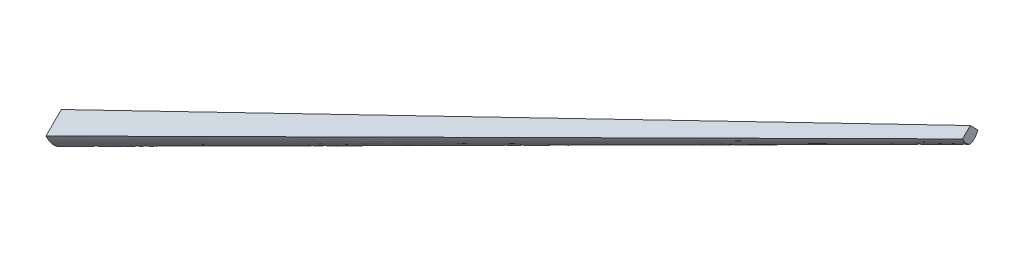
ISO-10303-21;
HEADER;
FILE_DESCRIPTION(('STEP AP214'),'2;1');
FILE_NAME('part.step','',(''),(''),'','','');
FILE_SCHEMA(('AUTOMOTIVE_DESIGN { 1 0 10303 214 1 1 1 1 }'));
ENDSEC;
DATA;
#1=APPLICATION_CONTEXT('core data for automotive mechanical design processes');
#2=APPLICATION_PROTOCOL_DEFINITION('international standard','automotive_design',2000,#1);
#3=PRODUCT_CONTEXT('',#1,'mechanical');
#4=PRODUCT('Part','Part','',(#3));
#5=PRODUCT_RELATED_PRODUCT_CATEGORY('part','',(#4));
#6=PRODUCT_DEFINITION_FORMATION('','',#4);
#7=PRODUCT_DEFINITION_CONTEXT('part definition',#1,'design');
#8=PRODUCT_DEFINITION('design','',#6,#7);
#9=PRODUCT_DEFINITION_SHAPE('','',#8);
#10=(LENGTH_UNIT() NAMED_UNIT(*) SI_UNIT(.MILLI.,.METRE.));
#11=(NAMED_UNIT(*) PLANE_ANGLE_UNIT() SI_UNIT($,.RADIAN.));
#12=(NAMED_UNIT(*) SI_UNIT($,.STERADIAN.) SOLID_ANGLE_UNIT());
#13=UNCERTAINTY_MEASURE_WITH_UNIT(LENGTH_MEASURE(1.E-05),#10,'distance_accuracy_value','');
#14=(GEOMETRIC_REPRESENTATION_CONTEXT(3) GLOBAL_UNCERTAINTY_ASSIGNED_CONTEXT((#13)) GLOBAL_UNIT_ASSIGNED_CONTEXT((#10,
#11,#12)) REPRESENTATION_CONTEXT('',''));
#15=CARTESIAN_POINT('',(0.,0.,0.));
#16=DIRECTION('',(0.,0.,1.));
#17=DIRECTION('',(1.,0.,0.));
#18=AXIS2_PLACEMENT_3D('',#15,#16,#17);
#19=CARTESIAN_POINT('',(57.,114.4,0.));
#20=CARTESIAN_POINT('',(0.,114.4,0.));
#21=CARTESIAN_POINT('',(57.,114.4,-0.00182095810749763));
#22=CARTESIAN_POINT('',(0.,114.4,-0.00364191621499526));
#23=CARTESIAN_POINT('',(57.,114.352907672617,-0.00546220916385912));
#24=CARTESIAN_POINT('',(0.,114.305815345234,-0.0109244183277182));
#25=CARTESIAN_POINT('',(57.,114.32002966172,-0.0109070616915182));
#26=CARTESIAN_POINT('',(0.,114.240059323441,-0.0218141233830365));
#27=CARTESIAN_POINT('',(57.,114.249222738711,-0.0198785714299646));
#28=CARTESIAN_POINT('',(0.,114.098445477423,-0.0397571428599293));
#29=CARTESIAN_POINT('',(57.,114.156548337744,-0.032132456041945));
#30=CARTESIAN_POINT('',(0.,113.913096675488,-0.0642649120838899));
#31=CARTESIAN_POINT('',(57.,114.034213823481,-0.0474417351200506));
#32=CARTESIAN_POINT('',(0.,113.668427646962,-0.0948834702401012));
#33=CARTESIAN_POINT('',(57.,113.886541749933,-0.0656072474393022));
#34=CARTESIAN_POINT('',(0.,113.373083499866,-0.131214494878604));
#35=CARTESIAN_POINT('',(57.,113.370012426993,-0.127548617429597));
#36=CARTESIAN_POINT('',(0.,112.340024853985,-0.255097234859193));
#37=CARTESIAN_POINT('',(57.,112.137163028017,-0.259027461460315));
#38=CARTESIAN_POINT('',(0.,109.874326056035,-0.51805492292063));
#39=CARTESIAN_POINT('',(57.,110.501004902275,-0.411740073326686));
#40=CARTESIAN_POINT('',(0.,106.60200980455,-0.823480146653373));
#41=CARTESIAN_POINT('',(57.,108.197187000479,-0.60964155845022));
#42=CARTESIAN_POINT('',(0.,101.994374000957,-1.21928311690044));
#43=CARTESIAN_POINT('',(57.,105.44956023543,-0.82314706743673));
#44=CARTESIAN_POINT('',(0.,96.4991204708607,-1.64629413487346));
#45=CARTESIAN_POINT('',(57.,101.925918142368,-1.05329602538316));
#46=CARTESIAN_POINT('',(0.,89.4518362847364,-2.10659205076633));
#47=CARTESIAN_POINT('',(57.0000000000001,98.2774944583724,-1.22854383866665));
#48=CARTESIAN_POINT('',(0.,82.1549889167448,-2.45708767733329));
#49=CARTESIAN_POINT('',(57.,95.5458702597783,-1.29200246249632));
#50=CARTESIAN_POINT('',(0.,76.6917405195566,-2.58400492499264));
#51=CARTESIAN_POINT('',(57.,93.7843198333664,-1.28990739427786));
#52=CARTESIAN_POINT('',(0.,73.1686396667328,-2.57981478855572));
#53=CARTESIAN_POINT('',(57.,92.7064529548784,-1.27556105945408));
#54=CARTESIAN_POINT('',(0.,71.0129059097568,-2.55112211890817));
#55=CARTESIAN_POINT('',(57.,91.4434168803456,-1.23757411909588));
#56=CARTESIAN_POINT('',(0.,68.4868337606911,-2.47514823819176));
#57=CARTESIAN_POINT('',(57.,89.8610871222189,-1.14403607707087));
#58=CARTESIAN_POINT('',(0.,65.3221742444376,-2.28807215414174));
#59=CARTESIAN_POINT('',(56.9999999999999,88.6339594379661,-1.01587816182833));
#60=CARTESIAN_POINT('',(0.,62.8679188759322,-2.03175632365666));
#61=CARTESIAN_POINT('',(57.,87.7322213407688,-0.870007471666012));
#62=CARTESIAN_POINT('',(0.,61.0644426815377,-1.74001494333202));
#63=CARTESIAN_POINT('',(57.,87.291174629283,-0.784346378199465));
#64=CARTESIAN_POINT('',(0.,60.1823492585658,-1.56869275639893));
#65=CARTESIAN_POINT('',(57.,86.9042703456185,-0.693141039222563));
#66=CARTESIAN_POINT('',(0.,59.4085406912369,-1.38628207844513));
#67=CARTESIAN_POINT('',(57.,86.5733208454091,-0.59333455424871));
#68=CARTESIAN_POINT('',(0.,58.746641690818,-1.18666910849742));
#69=CARTESIAN_POINT('',(57.,86.2785415535032,-0.4748173297146));
#70=CARTESIAN_POINT('',(0.,58.1570831070064,-0.9496346594292));
#71=CARTESIAN_POINT('',(57.,86.0648861911922,-0.349405025256917));
#72=CARTESIAN_POINT('',(0.,57.7297723823844,-0.698810050513834));
#73=CARTESIAN_POINT('',(57.,85.9154971726472,-0.217553009946631));
#74=CARTESIAN_POINT('',(0.,57.4309943452943,-0.435106019893263));
#75=CARTESIAN_POINT('',(57.,85.8398706402099,-0.125468872465283));
#76=CARTESIAN_POINT('',(0.,57.2797412804197,-0.250937744930566));
#77=CARTESIAN_POINT('',(57.,85.8046969145248,-0.0466468105661051));
#78=CARTESIAN_POINT('',(0.,57.2093938290495,-0.0932936211322103));
#79=CARTESIAN_POINT('',(57.,85.7984647875065,0.));
#80=CARTESIAN_POINT('',(0.,57.196929575013,0.));
#81=CARTESIAN_POINT('',(57.,85.8046969145248,0.0466468105660989));
#82=CARTESIAN_POINT('',(0.,57.2093938290495,0.0932936211321978));
#83=CARTESIAN_POINT('',(57.,85.8398706402099,0.125468872465298));
#84=CARTESIAN_POINT('',(0.,57.2797412804197,0.250937744930596));
#85=CARTESIAN_POINT('',(57.,85.9154971726472,0.217553009946615));
#86=CARTESIAN_POINT('',(0.,57.4309943452942,0.43510601989323));
#87=CARTESIAN_POINT('',(57.,86.0648861911922,0.349405025256929));
#88=CARTESIAN_POINT('',(0.,57.7297723823844,0.698810050513857));
#89=CARTESIAN_POINT('',(57.,86.2785415535032,0.474817329714599));
#90=CARTESIAN_POINT('',(0.,58.1570831070064,0.949634659429199));
#91=CARTESIAN_POINT('',(57.,86.5733208454091,0.593334554248706));
#92=CARTESIAN_POINT('',(0.,58.746641690818,1.18666910849741));
#93=CARTESIAN_POINT('',(57.,86.9042703456185,0.693141039222563));
#94=CARTESIAN_POINT('',(0.,59.4085406912369,1.38628207844513));
#95=CARTESIAN_POINT('',(57.,87.2911746292829,0.784346378199468));
#96=CARTESIAN_POINT('',(0.,60.1823492585659,1.56869275639894));
#97=CARTESIAN_POINT('',(57.,87.7322213407688,0.870007471666016));
#98=CARTESIAN_POINT('',(0.,61.0644426815377,1.74001494333203));
#99=CARTESIAN_POINT('',(57.,88.6339594379661,1.01587816182832));
#100=CARTESIAN_POINT('',(0.,62.867918875932,2.03175632365664));
#101=CARTESIAN_POINT('',(57.,89.8610871222189,1.14403607707087));
#102=CARTESIAN_POINT('',(0.,65.3221742444377,2.28807215414174));
#103=CARTESIAN_POINT('',(57.,91.4434168803456,1.23757411909588));
#104=CARTESIAN_POINT('',(0.,68.4868337606911,2.47514823819176));
#105=CARTESIAN_POINT('',(57.,92.7064529548784,1.27556105945408));
#106=CARTESIAN_POINT('',(0.,71.0129059097568,2.55112211890816));
#107=CARTESIAN_POINT('',(57.,93.7843198333664,1.28990739427786));
#108=CARTESIAN_POINT('',(0.,73.1686396667329,2.57981478855573));
#109=CARTESIAN_POINT('',(57.,95.5458702597782,1.29200246249631));
#110=CARTESIAN_POINT('',(0.,76.6917405195565,2.58400492499263));
#111=CARTESIAN_POINT('',(57.,98.2774944583724,1.22854383866664));
#112=CARTESIAN_POINT('',(0.,82.1549889167447,2.45708767733329));
#113=CARTESIAN_POINT('',(57.,101.925918142368,1.05329602538317));
#114=CARTESIAN_POINT('',(0.,89.4518362847363,2.10659205076633));
#115=CARTESIAN_POINT('',(57.,105.44956023543,0.823147067436728));
#116=CARTESIAN_POINT('',(0.,96.4991204708606,1.64629413487346));
#117=CARTESIAN_POINT('',(57.,108.197187000479,0.609641558450223));
#118=CARTESIAN_POINT('',(0.,101.994374000957,1.21928311690045));
#119=CARTESIAN_POINT('',(57.,110.501004902275,0.411740073326685));
#120=CARTESIAN_POINT('',(0.,106.60200980455,0.823480146653369));
#121=CARTESIAN_POINT('',(57.,112.137163028017,0.259027461460316));
#122=CARTESIAN_POINT('',(0.,109.874326056034,0.518054922920633));
#123=CARTESIAN_POINT('',(57.,113.370012426993,0.127548617429595));
#124=CARTESIAN_POINT('',(0.,112.340024853985,0.25509723485919));
#125=CARTESIAN_POINT('',(57.,113.886541749933,0.0656072474393026));
#126=CARTESIAN_POINT('',(0.,113.373083499866,0.131214494878605));
#127=CARTESIAN_POINT('',(57.,114.034213823481,0.0474417351200502));
#128=CARTESIAN_POINT('',(0.,113.668427646962,0.0948834702401005));
#129=CARTESIAN_POINT('',(57.,114.156548337744,0.0321324560419456));
#130=CARTESIAN_POINT('',(0.,113.913096675488,0.0642649120838911));
#131=CARTESIAN_POINT('',(57.,114.249222738711,0.0198785714299638));
#132=CARTESIAN_POINT('',(0.,114.098445477423,0.0397571428599277));
#133=CARTESIAN_POINT('',(57.,114.32002966172,0.0109070616915188));
#134=CARTESIAN_POINT('',(0.,114.240059323441,0.0218141233830376));
#135=CARTESIAN_POINT('',(57.,114.352907672617,0.00546220916385825));
#136=CARTESIAN_POINT('',(0.,114.305815345234,0.0109244183277165));
#137=CARTESIAN_POINT('',(57.,114.4,0.00182095810749828));
#138=CARTESIAN_POINT('',(0.,114.4,0.00364191621499655));
#139=CARTESIAN_POINT('',(57.,114.4,0.));
#140=CARTESIAN_POINT('',(0.,114.4,0.));
#141=B_SPLINE_SURFACE_WITH_KNOTS('',3,1,((#19,#20),(#21,#22),(#23,#24),(#25,#26),(#27,#28),(#29,
#30),(#31,#32),(#33,#34),(#35,#36),(#37,#38),(#39,#40),(#41,#42),(#43,#44),(#45,#46),(#47,#48),
(#49,#50),(#51,#52),(#53,#54),(#55,#56),(#57,#58),(#59,#60),(#61,#62),(#63,#64),(#65,#66),(#67,
#68),(#69,#70),(#71,#72),(#73,#74),(#75,#76),(#77,#78),(#79,#80),(#81,#82),(#83,#84),(#85,#86),
(#87,#88),(#89,#90),(#91,#92),(#93,#94),(#95,#96),(#97,#98),(#99,#100),(#101,#102),(#103,#104),
(#105,#106),(#107,#108),(#109,#110),(#111,#112),(#113,#114),(#115,#116),(#117,#118),(#119,#120),
(#121,#122),(#123,#124),(#125,#126),(#127,#128),(#129,#130),(#131,#132),(#133,#134),(#135,#136),
(#137,#138),(#139,#140)),.UNSPECIFIED.,.T.,.F.,.F.,(4,1,1,1,1,1,1,1,1,1,1,1,1,1,1,1,1,1,1,1,1,1,
1,1,1,1,1,1,1,1,1,1,1,1,1,1,1,1,1,1,1,1,1,1,1,1,1,1,1,1,1,1,1,1,1,1,1,1,4),(2,2),(0.,
0.000711185839145978,0.00142211189669672,0.00213325230730554,0.00425158120835245,
0.00636919832710714,0.00848752581630519,0.0119730784810976,0.0333165732602392,0.072750532853801,
0.0971333248630511,0.153150736130299,0.215572756141474,0.280129489501461,0.342436877180773,
0.35716003719228,0.371419982611637,0.398301185339692,0.422640862362832,0.453555830037826,
0.462206438132531,0.469975829256052,0.476836911130722,0.482800105251618,0.487877314409996,
0.493276037135274,0.495568649395588,0.498179926351265,0.499405098860122,0.5,0.500594901139878,
0.501820073648734,0.504431350604412,0.506723962864726,0.512122685590004,0.517199894748382,
0.523163088869278,0.530024170743948,0.537793561867469,0.546444169962174,0.577359137637168,
0.601698814660308,0.628580017388363,0.64283996280772,0.657563122819227,0.719870510498539,
0.784427243858526,0.846849263869701,0.902866675136949,0.927249467146199,0.966683426739761,
0.988026921518902,0.991512474183695,0.993630801672893,0.995748418791648,0.997866747692694,
0.998577888103303,0.999288814160854,1.),(0.,1.),.UNSPECIFIED.);
#142=CARTESIAN_POINT('',(56.9999999977462,86.3156769642935,-0.484323024222505));
#143=CARTESIAN_POINT('',(56.723188026537,86.1791888609529,-0.486627702093037));
#144=CARTESIAN_POINT('',(56.4463760531051,86.0427007620061,-0.488932373217639));
#145=CARTESIAN_POINT('',(55.0623161748737,85.3602602891833,-0.500455696644035));
#146=CARTESIAN_POINT('',(53.9550682368587,84.8143079810409,-0.50967425235599));
#147=CARTESIAN_POINT('',(50.6333243181185,83.1764512647215,-0.537329669273207));
#148=CARTESIAN_POINT('',(48.418828232698,82.0845470646526,-0.555766280259819));
#149=CARTESIAN_POINT('',(43.9898358644925,79.9007390564533,-0.592639008458857));
#150=CARTESIAN_POINT('',(41.7753395817075,78.808835248323,-0.611075125671283));
#151=CARTESIAN_POINT('',(37.3463468638902,76.6250279345111,-0.64794698546232));
#152=CARTESIAN_POINT('',(35.1318504288578,75.5331244288295,-0.666382728040931));
#153=CARTESIAN_POINT('',(28.4883609496691,72.2574142575896,-0.721689525130715));
#154=CARTESIAN_POINT('',(24.0593677314214,70.0736079378362,-0.758560148995838));
#155=CARTESIAN_POINT('',(16.5373405146099,66.3647181250146,-0.821179141337033));
#156=CARTESIAN_POINT('',(13.4443065914509,64.8396344821615,-0.846927696053813));
#157=CARTESIAN_POINT('',(7.25823850376851,61.7894673509992,-0.898424533891937));
#158=CARTESIAN_POINT('',(4.16520433924512,60.26438386269,-0.924172817013271));
#159=CARTESIAN_POINT('',(0.71478008699755,58.5630820305551,-0.952896113311339));
#160=CARTESIAN_POINT('',(0.357390041230053,58.386863603387,-0.955871230158257));
#161=CARTESIAN_POINT('',(-5.08568986923308E-09,58.2106451773079,-0.958846345650579));
#162=B_SPLINE_CURVE_WITH_KNOTS('',3,(#142,#143,#144,#145,#146,#147,#148,#149,#150,#151,#152,
#153,#154,#155,#156,#157,#158,#159,#160,#161),.UNSPECIFIED.,.F.,.F.,(4,2,2,2,2,2,2,2,2,4),(0.,
0.925922584066982,4.62961292033495,12.036993592871,19.4443742654069,26.8517549379429,
41.6665162830149,52.0125598553291,62.3586038659523,63.5540556097998),.UNSPECIFIED.);
#163=CARTESIAN_POINT('',(57.,86.315676970247,-0.484323029753021));
#164=VERTEX_POINT('',#163);
#165=CARTESIAN_POINT('',(0.,58.2106451766361,-0.958846348787648));
#166=VERTEX_POINT('',#165);
#167=EDGE_CURVE('E77',#164,#166,#162,.T.);
#168=CARTESIAN_POINT('',(57.,114.4,0.));
#169=CARTESIAN_POINT('',(57.,114.4,-0.00182095810749763));
#170=CARTESIAN_POINT('',(57.,114.352907672617,-0.00546220916385912));
#171=CARTESIAN_POINT('',(57.,114.32002966172,-0.0109070616915182));
#172=CARTESIAN_POINT('',(57.,114.249222738711,-0.0198785714299646));
#173=CARTESIAN_POINT('',(57.,114.156548337744,-0.032132456041945));
#174=CARTESIAN_POINT('',(57.,114.034213823481,-0.0474417351200506));
#175=CARTESIAN_POINT('',(57.,113.886541749933,-0.0656072474393022));
#176=CARTESIAN_POINT('',(57.,113.370012426993,-0.127548617429597));
#177=CARTESIAN_POINT('',(57.,112.137163028017,-0.259027461460315));
#178=CARTESIAN_POINT('',(57.,110.501004902275,-0.411740073326686));
#179=CARTESIAN_POINT('',(57.,108.197187000479,-0.60964155845022));
#180=CARTESIAN_POINT('',(57.,105.44956023543,-0.82314706743673));
#181=CARTESIAN_POINT('',(57.,101.925918142368,-1.05329602538316));
#182=CARTESIAN_POINT('',(57.0000000000001,98.2774944583724,-1.22854383866665));
#183=CARTESIAN_POINT('',(57.,95.5458702597783,-1.29200246249632));
#184=CARTESIAN_POINT('',(57.,93.7843198333664,-1.28990739427786));
#185=CARTESIAN_POINT('',(57.,92.7064529548784,-1.27556105945408));
#186=CARTESIAN_POINT('',(57.,91.4434168803456,-1.23757411909588));
#187=CARTESIAN_POINT('',(57.,89.8610871222189,-1.14403607707087));
#188=CARTESIAN_POINT('',(56.9999999999999,88.6339594379661,-1.01587816182833));
#189=CARTESIAN_POINT('',(57.,87.7322213407688,-0.870007471666012));
#190=CARTESIAN_POINT('',(57.,87.291174629283,-0.784346378199465));
#191=CARTESIAN_POINT('',(57.,86.9042703456185,-0.693141039222563));
#192=CARTESIAN_POINT('',(57.,86.5733208454091,-0.59333455424871));
#193=CARTESIAN_POINT('',(57.,86.2785415535032,-0.4748173297146));
#194=CARTESIAN_POINT('',(57.,86.0648861911922,-0.349405025256917));
#195=CARTESIAN_POINT('',(57.,85.9154971726472,-0.217553009946631));
#196=CARTESIAN_POINT('',(57.,85.8398706402099,-0.125468872465283));
#197=CARTESIAN_POINT('',(57.,85.8046969145248,-0.0466468105661051));
#198=CARTESIAN_POINT('',(57.,85.7984647875065,0.));
#199=CARTESIAN_POINT('',(57.,85.8046969145248,0.0466468105660989));
#200=CARTESIAN_POINT('',(57.,85.8398706402099,0.125468872465298));
#201=CARTESIAN_POINT('',(57.,85.9154971726472,0.217553009946615));
#202=CARTESIAN_POINT('',(57.,86.0648861911922,0.349405025256929));
#203=CARTESIAN_POINT('',(57.,86.2785415535032,0.474817329714599));
#204=CARTESIAN_POINT('',(57.,86.5733208454091,0.593334554248706));
#205=CARTESIAN_POINT('',(57.,86.9042703456185,0.693141039222563));
#206=CARTESIAN_POINT('',(57.,87.2911746292829,0.784346378199468));
#207=CARTESIAN_POINT('',(57.,87.7322213407688,0.870007471666016));
#208=CARTESIAN_POINT('',(57.,88.6339594379661,1.01587816182832));
#209=CARTESIAN_POINT('',(57.,89.8610871222189,1.14403607707087));
#210=CARTESIAN_POINT('',(57.,91.4434168803456,1.23757411909588));
#211=CARTESIAN_POINT('',(57.,92.7064529548784,1.27556105945408));
#212=CARTESIAN_POINT('',(57.,93.7843198333664,1.28990739427786));
#213=CARTESIAN_POINT('',(57.,95.5458702597782,1.29200246249631));
#214=CARTESIAN_POINT('',(57.,98.2774944583724,1.22854383866664));
#215=CARTESIAN_POINT('',(57.,101.925918142368,1.05329602538317));
#216=CARTESIAN_POINT('',(57.,105.44956023543,0.823147067436728));
#217=CARTESIAN_POINT('',(57.,108.197187000479,0.609641558450223));
#218=CARTESIAN_POINT('',(57.,110.501004902275,0.411740073326685));
#219=CARTESIAN_POINT('',(57.,112.137163028017,0.259027461460316));
#220=CARTESIAN_POINT('',(57.,113.370012426993,0.127548617429595));
#221=CARTESIAN_POINT('',(57.,113.886541749933,0.0656072474393026));
#222=CARTESIAN_POINT('',(57.,114.034213823481,0.0474417351200502));
#223=CARTESIAN_POINT('',(57.,114.156548337744,0.0321324560419456));
#224=CARTESIAN_POINT('',(57.,114.249222738711,0.0198785714299638));
#225=CARTESIAN_POINT('',(57.,114.32002966172,0.0109070616915188));
#226=CARTESIAN_POINT('',(57.,114.352907672617,0.00546220916385825));
#227=CARTESIAN_POINT('',(57.,114.4,0.00182095810749828));
#228=CARTESIAN_POINT('',(57.,114.4,0.));
#229=B_SPLINE_CURVE_WITH_KNOTS('',3,(#168,#169,#170,#171,#172,#173,#174,#175,#176,#177,#178,
#179,#180,#181,#182,#183,#184,#185,#186,#187,#188,#189,#190,#191,#192,#193,#194,#195,#196,#197,
#198,#199,#200,#201,#202,#203,#204,#205,#206,#207,#208,#209,#210,#211,#212,#213,#214,#215,#216,
#217,#218,#219,#220,#221,#222,#223,#224,#225,#226,#227,#228),.UNSPECIFIED.,.T.,.F.,(4,1,1,1,1,1,
1,1,1,1,1,1,1,1,1,1,1,1,1,1,1,1,1,1,1,1,1,1,1,1,1,1,1,1,1,1,1,1,1,1,1,1,1,1,1,1,1,1,1,1,1,1,1,1,
1,1,1,1,4),(0.,0.000711185839145978,0.00142211189669672,0.00213325230730554,0.00425158120835245,
0.00636919832710714,0.00848752581630519,0.0119730784810976,0.0333165732602392,0.072750532853801,
0.0971333248630511,0.153150736130299,0.215572756141474,0.280129489501461,0.342436877180773,
0.35716003719228,0.371419982611637,0.398301185339692,0.422640862362832,0.453555830037826,
0.462206438132531,0.469975829256052,0.476836911130722,0.482800105251618,0.487877314409996,
0.493276037135274,0.495568649395588,0.498179926351265,0.499405098860122,0.5,0.500594901139878,
0.501820073648734,0.504431350604412,0.506723962864726,0.512122685590004,0.517199894748382,
0.523163088869278,0.530024170743948,0.537793561867469,0.546444169962174,0.577359137637168,
0.601698814660308,0.628580017388363,0.64283996280772,0.657563122819227,0.719870510498539,
0.784427243858526,0.846849263869701,0.902866675136949,0.927249467146199,0.966683426739761,
0.988026921518902,0.991512474183695,0.993630801672893,0.995748418791648,0.997866747692694,
0.998577888103303,0.999288814160854,1.),.UNSPECIFIED.);
#230=CARTESIAN_POINT('',(57.,86.315676970247,0.48432302975302));
#231=VERTEX_POINT('',#230);
#232=EDGE_CURVE('E101',#164,#231,#229,.T.);
#233=CARTESIAN_POINT('',(-2.06986288422845E-09,58.2106451711588,0.958846343718181));
#234=CARTESIAN_POINT('',(0.539355628737348,58.4765854304048,0.954356445363687));
#235=CARTESIAN_POINT('',(1.07871125865091,58.7425256914064,0.949866543649447));
#236=CARTESIAN_POINT('',(3.77548940302937,60.0722270066476,0.927417017812049));
#237=CARTESIAN_POINT('',(5.9329119019263,61.1359880915862,0.909457341890303));
#238=CARTESIAN_POINT('',(12.4051793211108,64.3272715004916,0.855578130418956));
#239=CARTESIAN_POINT('',(16.720024163892,66.4547939785481,0.819658411163249));
#240=CARTESIAN_POINT('',(25.3497135598155,70.7098395098994,0.747818251203424));
#241=CARTESIAN_POINT('',(29.6645581129579,72.8373625631941,0.711897810499307));
#242=CARTESIAN_POINT('',(36.1368245978654,76.0286478280787,0.65801629887538));
#243=CARTESIAN_POINT('',(38.2942467020335,77.0924096971973,0.640055653239446));
#244=CARTESIAN_POINT('',(42.7552022305405,79.2919770454123,0.60291759519808));
#245=CARTESIAN_POINT('',(45.0587356444267,80.4277825452713,0.583740156953962));
#246=CARTESIAN_POINT('',(49.6658023915649,82.6993940660754,0.545384720332582));
#247=CARTESIAN_POINT('',(51.9693357248169,83.8352000870205,0.526206721955285));
#248=CARTESIAN_POINT('',(55.1819126234081,85.4192298881326,0.499459959825805));
#249=CARTESIAN_POINT('',(56.0909563226735,85.8674534022713,0.491891527026478));
#250=CARTESIAN_POINT('',(56.9999999944368,86.3156769710398,0.484323026263452));
#251=B_SPLINE_CURVE_WITH_KNOTS('',3,(#233,#234,#235,#236,#237,#238,#239,#240,#241,#242,#243,
#244,#245,#246,#247,#248,#249,#250),.UNSPECIFIED.,.F.,.F.,(4,2,2,2,2,2,2,2,4),(0.,
1.8041174835432,9.02058741771602,23.4535272860617,37.8864671544075,45.1029370885803,
52.8081426581183,60.5133487145556,63.5540556097997),.UNSPECIFIED.);
#252=CARTESIAN_POINT('',(0.,58.2106451766361,0.958846348787645));
#253=VERTEX_POINT('',#252);
#254=EDGE_CURVE('E95',#253,#231,#251,.T.);
#255=CARTESIAN_POINT('',(0.,114.4,0.));
#256=CARTESIAN_POINT('',(0.,114.4,-0.00364191621499526));
#257=CARTESIAN_POINT('',(0.,114.305815345234,-0.0109244183277182));
#258=CARTESIAN_POINT('',(0.,114.240059323441,-0.0218141233830365));
#259=CARTESIAN_POINT('',(0.,114.098445477423,-0.0397571428599293));
#260=CARTESIAN_POINT('',(0.,113.913096675488,-0.0642649120838899));
#261=CARTESIAN_POINT('',(0.,113.668427646962,-0.0948834702401012));
#262=CARTESIAN_POINT('',(0.,113.373083499866,-0.131214494878604));
#263=CARTESIAN_POINT('',(0.,112.340024853985,-0.255097234859193));
#264=CARTESIAN_POINT('',(0.,109.874326056035,-0.51805492292063));
#265=CARTESIAN_POINT('',(0.,106.60200980455,-0.823480146653373));
#266=CARTESIAN_POINT('',(0.,101.994374000957,-1.21928311690044));
#267=CARTESIAN_POINT('',(0.,96.4991204708607,-1.64629413487346));
#268=CARTESIAN_POINT('',(0.,89.4518362847364,-2.10659205076633));
#269=CARTESIAN_POINT('',(0.,82.1549889167448,-2.45708767733329));
#270=CARTESIAN_POINT('',(0.,76.6917405195566,-2.58400492499264));
#271=CARTESIAN_POINT('',(0.,73.1686396667328,-2.57981478855572));
#272=CARTESIAN_POINT('',(0.,71.0129059097568,-2.55112211890817));
#273=CARTESIAN_POINT('',(0.,68.4868337606911,-2.47514823819176));
#274=CARTESIAN_POINT('',(0.,65.3221742444376,-2.28807215414174));
#275=CARTESIAN_POINT('',(0.,62.8679188759322,-2.03175632365666));
#276=CARTESIAN_POINT('',(0.,61.0644426815377,-1.74001494333202));
#277=CARTESIAN_POINT('',(0.,60.1823492585658,-1.56869275639893));
#278=CARTESIAN_POINT('',(0.,59.4085406912369,-1.38628207844513));
#279=CARTESIAN_POINT('',(0.,58.746641690818,-1.18666910849742));
#280=CARTESIAN_POINT('',(0.,58.1570831070064,-0.9496346594292));
#281=CARTESIAN_POINT('',(0.,57.7297723823844,-0.698810050513834));
#282=CARTESIAN_POINT('',(0.,57.4309943452943,-0.435106019893263));
#283=CARTESIAN_POINT('',(0.,57.2797412804197,-0.250937744930566));
#284=CARTESIAN_POINT('',(0.,57.2093938290495,-0.0932936211322103));
#285=CARTESIAN_POINT('',(0.,57.196929575013,0.));
#286=CARTESIAN_POINT('',(0.,57.2093938290495,0.0932936211321978));
#287=CARTESIAN_POINT('',(0.,57.2797412804197,0.250937744930596));
#288=CARTESIAN_POINT('',(0.,57.4309943452942,0.43510601989323));
#289=CARTESIAN_POINT('',(0.,57.7297723823844,0.698810050513857));
#290=CARTESIAN_POINT('',(0.,58.1570831070064,0.949634659429199));
#291=CARTESIAN_POINT('',(0.,58.746641690818,1.18666910849741));
#292=CARTESIAN_POINT('',(0.,59.4085406912369,1.38628207844513));
#293=CARTESIAN_POINT('',(0.,60.1823492585659,1.56869275639894));
#294=CARTESIAN_POINT('',(0.,61.0644426815377,1.74001494333203));
#295=CARTESIAN_POINT('',(0.,62.867918875932,2.03175632365664));
#296=CARTESIAN_POINT('',(0.,65.3221742444377,2.28807215414174));
#297=CARTESIAN_POINT('',(0.,68.4868337606911,2.47514823819176));
#298=CARTESIAN_POINT('',(0.,71.0129059097568,2.55112211890816));
#299=CARTESIAN_POINT('',(0.,73.1686396667329,2.57981478855573));
#300=CARTESIAN_POINT('',(0.,76.6917405195565,2.58400492499263));
#301=CARTESIAN_POINT('',(0.,82.1549889167447,2.45708767733329));
#302=CARTESIAN_POINT('',(0.,89.4518362847363,2.10659205076633));
#303=CARTESIAN_POINT('',(0.,96.4991204708606,1.64629413487346));
#304=CARTESIAN_POINT('',(0.,101.994374000957,1.21928311690045));
#305=CARTESIAN_POINT('',(0.,106.60200980455,0.823480146653369));
#306=CARTESIAN_POINT('',(0.,109.874326056034,0.518054922920633));
#307=CARTESIAN_POINT('',(0.,112.340024853985,0.25509723485919));
#308=CARTESIAN_POINT('',(0.,113.373083499866,0.131214494878605));
#309=CARTESIAN_POINT('',(0.,113.668427646962,0.0948834702401005));
#310=CARTESIAN_POINT('',(0.,113.913096675488,0.0642649120838911));
#311=CARTESIAN_POINT('',(0.,114.098445477423,0.0397571428599277));
#312=CARTESIAN_POINT('',(0.,114.240059323441,0.0218141233830376));
#313=CARTESIAN_POINT('',(0.,114.305815345234,0.0109244183277165));
#314=CARTESIAN_POINT('',(0.,114.4,0.00364191621499655));
#315=CARTESIAN_POINT('',(0.,114.4,0.));
#316=B_SPLINE_CURVE_WITH_KNOTS('',3,(#255,#256,#257,#258,#259,#260,#261,#262,#263,#264,#265,
#266,#267,#268,#269,#270,#271,#272,#273,#274,#275,#276,#277,#278,#279,#280,#281,#282,#283,#284,
#285,#286,#287,#288,#289,#290,#291,#292,#293,#294,#295,#296,#297,#298,#299,#300,#301,#302,#303,
#304,#305,#306,#307,#308,#309,#310,#311,#312,#313,#314,#315),.UNSPECIFIED.,.T.,.F.,(4,1,1,1,1,1,
1,1,1,1,1,1,1,1,1,1,1,1,1,1,1,1,1,1,1,1,1,1,1,1,1,1,1,1,1,1,1,1,1,1,1,1,1,1,1,1,1,1,1,1,1,1,1,1,
1,1,1,1,4),(0.,0.000711185839145978,0.00142211189669672,0.00213325230730554,0.00425158120835245,
0.00636919832710714,0.00848752581630519,0.0119730784810976,0.0333165732602392,0.072750532853801,
0.0971333248630511,0.153150736130299,0.215572756141474,0.280129489501461,0.342436877180773,
0.35716003719228,0.371419982611637,0.398301185339692,0.422640862362832,0.453555830037826,
0.462206438132531,0.469975829256052,0.476836911130722,0.482800105251618,0.487877314409996,
0.493276037135274,0.495568649395588,0.498179926351265,0.499405098860122,0.5,0.500594901139878,
0.501820073648734,0.504431350604412,0.506723962864726,0.512122685590004,0.517199894748382,
0.523163088869278,0.530024170743948,0.537793561867469,0.546444169962174,0.577359137637168,
0.601698814660308,0.628580017388363,0.64283996280772,0.657563122819227,0.719870510498539,
0.784427243858526,0.846849263869701,0.902866675136949,0.927249467146199,0.966683426739761,
0.988026921518902,0.991512474183695,0.993630801672893,0.995748418791648,0.997866747692694,
0.998577888103303,0.999288814160854,1.),.UNSPECIFIED.);
#317=EDGE_CURVE('E136',#166,#253,#316,.T.);
#318=ORIENTED_EDGE('',*,*,#167,.F.);
#319=ORIENTED_EDGE('',*,*,#232,.T.);
#320=ORIENTED_EDGE('',*,*,#254,.F.);
#321=ORIENTED_EDGE('',*,*,#317,.F.);
#322=EDGE_LOOP('',(#318,#319,#320,#321));
#323=FACE_BOUND('',#322,.T.);
#324=ADVANCED_FACE('F55',(#323),#141,.T.);
#325=CARTESIAN_POINT('',(57.,85.8,0.));
#326=DIRECTION('',(1.,0.,0.));
#327=DIRECTION('',(0.,0.,-1.));
#328=AXIS2_PLACEMENT_3D('',#325,#326,#327);
#329=PLANE('',#328);
#330=DIRECTION('',(0.,-0.707106781186542,-0.707106781186553));
#331=VECTOR('',#330,1.);
#332=CARTESIAN_POINT('',(57.,86.8,0.));
#333=LINE('',#332,#331);
#334=CARTESIAN_POINT('',(57.,86.8,0.));
#335=VERTEX_POINT('',#334);
#336=EDGE_CURVE('E88',#335,#164,#333,.T.);
#337=ORIENTED_EDGE('',*,*,#336,.F.);
#338=DIRECTION('',(0.,-0.707106781186553,0.707106781186542));
#339=VECTOR('',#338,1.);
#340=CARTESIAN_POINT('',(57.,86.8,0.));
#341=LINE('',#340,#339);
#342=EDGE_CURVE('E92',#231,#335,#341,.F.);
#343=ORIENTED_EDGE('',*,*,#342,.F.);
#344=ORIENTED_EDGE('',*,*,#232,.F.);
#345=EDGE_LOOP('',(#337,#343,#344));
#346=FACE_BOUND('',#345,.T.);
#347=ADVANCED_FACE('F100',(#346),#329,.T.);
#348=CARTESIAN_POINT('',(0.,57.2,0.));
#349=DIRECTION('',(1.,0.,0.));
#350=DIRECTION('',(0.,0.,-1.));
#351=AXIS2_PLACEMENT_3D('',#348,#349,#350);
#352=PLANE('',#351);
#353=DIRECTION('',(0.,0.707106781186553,-0.707106781186542));
#354=VECTOR('',#353,1.);
#355=CARTESIAN_POINT('',(0.,58.1847457627119,0.984745762711869));
#356=LINE('',#355,#354);
#357=CARTESIAN_POINT('',(0.,59.1694915254237,0.));
#358=VERTEX_POINT('',#357);
#359=EDGE_CURVE('E63',#253,#358,#356,.T.);
#360=ORIENTED_EDGE('',*,*,#359,.T.);
#361=DIRECTION('',(0.,-0.707106781186542,-0.707106781186553));
#362=VECTOR('',#361,1.);
#363=CARTESIAN_POINT('',(0.,58.1847457627119,-0.98474576271186));
#364=LINE('',#363,#362);
#365=EDGE_CURVE('E12',#358,#166,#364,.T.);
#366=ORIENTED_EDGE('',*,*,#365,.T.);
#367=ORIENTED_EDGE('',*,*,#317,.T.);
#368=EDGE_LOOP('',(#360,#366,#367));
#369=FACE_BOUND('',#368,.T.);
#370=ADVANCED_FACE('F57',(#369),#352,.F.);
#371=CARTESIAN_POINT('',(-2.00000000196091,58.1999999990495,0.));
#372=DIRECTION('',(0.324248033665077,-0.668903286232152,0.668903286232142));
#373=DIRECTION('',(0.,-0.707106781186542,-0.707106781186553));
#374=AXIS2_PLACEMENT_3D('',#371,#372,#373);
#375=PLANE('',#374);
#376=ORIENTED_EDGE('',*,*,#167,.T.);
#377=ORIENTED_EDGE('',*,*,#365,.F.);
#378=DIRECTION('',(0.899850390659934,0.436198663947019,0.));
#379=VECTOR('',#378,1.);
#380=CARTESIAN_POINT('',(-2.00000000196091,58.1999999990495,0.));
#381=LINE('',#380,#379);
#382=EDGE_CURVE('E70',#358,#335,#381,.T.);
#383=ORIENTED_EDGE('',*,*,#382,.T.);
#384=ORIENTED_EDGE('',*,*,#336,.T.);
#385=EDGE_LOOP('',(#376,#377,#383,#384));
#386=FACE_BOUND('',#385,.T.);
#387=ADVANCED_FACE('F86',(#386),#375,.F.);
#388=CARTESIAN_POINT('',(-2.00000000196091,58.1999999990495,0.));
#389=DIRECTION('',(0.324248033665073,-0.668903286232143,-0.668903286232153));
#390=DIRECTION('',(0.,0.707106781186553,-0.707106781186542));
#391=AXIS2_PLACEMENT_3D('',#388,#389,#390);
#392=PLANE('',#391);
#393=ORIENTED_EDGE('',*,*,#254,.T.);
#394=ORIENTED_EDGE('',*,*,#342,.T.);
#395=ORIENTED_EDGE('',*,*,#382,.F.);
#396=ORIENTED_EDGE('',*,*,#359,.F.);
#397=EDGE_LOOP('',(#393,#394,#395,#396));
#398=FACE_BOUND('',#397,.T.);
#399=ADVANCED_FACE('F93',(#398),#392,.F.);
#400=CLOSED_SHELL('',(#324,#347,#370,#387,#399));
#401=MANIFOLD_SOLID_BREP('B2',#400);
#402=ADVANCED_BREP_SHAPE_REPRESENTATION('',(#18,#401),#14);
#403=SHAPE_DEFINITION_REPRESENTATION(#9,#402);
ENDSEC;
END-ISO-10303-21;
